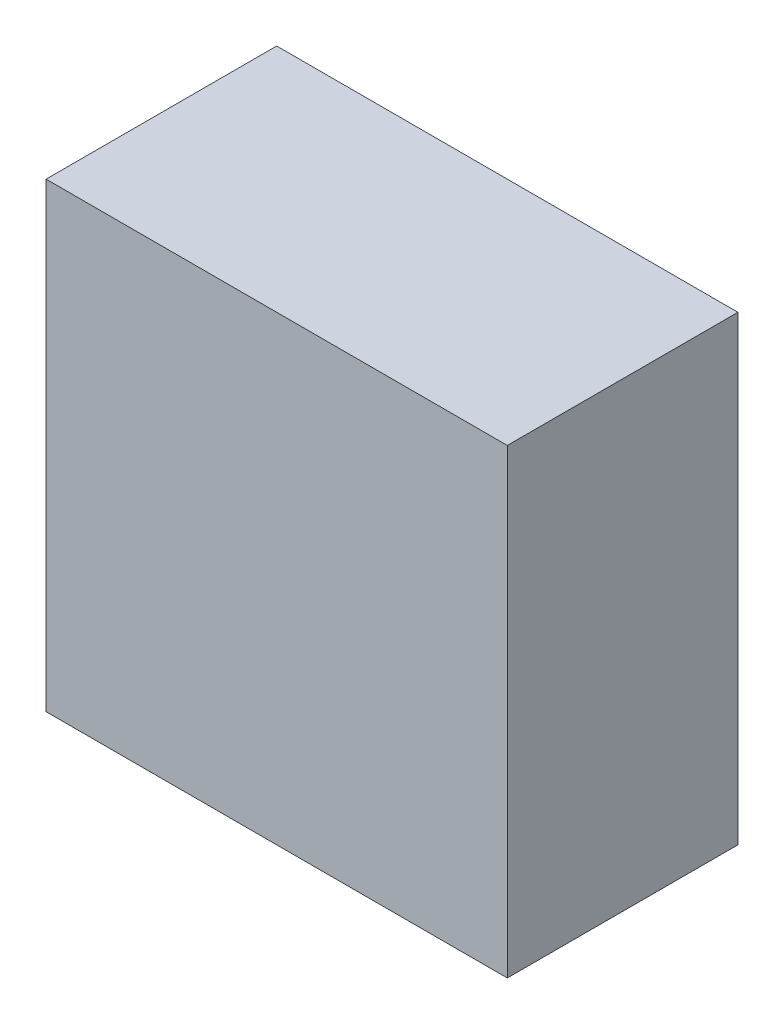
ISO-10303-21;
HEADER;
FILE_DESCRIPTION(('STEP AP214'),'2;1');
FILE_NAME('part.step','',(''),(''),'','','');
FILE_SCHEMA(('AUTOMOTIVE_DESIGN { 1 0 10303 214 1 1 1 1 }'));
ENDSEC;
DATA;
#1=APPLICATION_CONTEXT('core data for automotive mechanical design processes');
#2=APPLICATION_PROTOCOL_DEFINITION('international standard','automotive_design',2000,#1);
#3=PRODUCT_CONTEXT('',#1,'mechanical');
#4=PRODUCT('Part','Part','',(#3));
#5=PRODUCT_RELATED_PRODUCT_CATEGORY('part','',(#4));
#6=PRODUCT_DEFINITION_FORMATION('','',#4);
#7=PRODUCT_DEFINITION_CONTEXT('part definition',#1,'design');
#8=PRODUCT_DEFINITION('design','',#6,#7);
#9=PRODUCT_DEFINITION_SHAPE('','',#8);
#10=(LENGTH_UNIT() NAMED_UNIT(*) SI_UNIT(.MILLI.,.METRE.));
#11=(NAMED_UNIT(*) PLANE_ANGLE_UNIT() SI_UNIT($,.RADIAN.));
#12=(NAMED_UNIT(*) SI_UNIT($,.STERADIAN.) SOLID_ANGLE_UNIT());
#13=UNCERTAINTY_MEASURE_WITH_UNIT(LENGTH_MEASURE(1.E-05),#10,'distance_accuracy_value','');
#14=(GEOMETRIC_REPRESENTATION_CONTEXT(3) GLOBAL_UNCERTAINTY_ASSIGNED_CONTEXT((#13)) GLOBAL_UNIT_ASSIGNED_CONTEXT((#10,
#11,#12)) REPRESENTATION_CONTEXT('',''));
#15=CARTESIAN_POINT('',(0.,0.,0.));
#16=DIRECTION('',(0.,0.,1.));
#17=DIRECTION('',(1.,0.,0.));
#18=AXIS2_PLACEMENT_3D('',#15,#16,#17);
#19=CARTESIAN_POINT('',(0.,0.,1524.));
#20=DIRECTION('',(1.,0.,0.));
#21=DIRECTION('',(0.,0.,-1.));
#22=AXIS2_PLACEMENT_3D('',#19,#20,#21);
#23=PLANE('',#22);
#24=DIRECTION('',(0.,-1.,0.));
#25=VECTOR('',#24,1.);
#26=CARTESIAN_POINT('',(0.,0.,0.));
#27=LINE('',#26,#25);
#28=CARTESIAN_POINT('',(0.,3048.,0.));
#29=VERTEX_POINT('',#28);
#30=CARTESIAN_POINT('',(0.,0.,0.));
#31=VERTEX_POINT('',#30);
#32=EDGE_CURVE('E98',#29,#31,#27,.T.);
#33=ORIENTED_EDGE('',*,*,#32,.T.);
#34=DIRECTION('',(0.,0.,-1.));
#35=VECTOR('',#34,1.);
#36=CARTESIAN_POINT('',(0.,0.,1524.));
#37=LINE('',#36,#35);
#38=CARTESIAN_POINT('',(0.,0.,1524.));
#39=VERTEX_POINT('',#38);
#40=EDGE_CURVE('E11',#39,#31,#37,.T.);
#41=ORIENTED_EDGE('',*,*,#40,.F.);
#42=DIRECTION('',(0.,-1.,0.));
#43=VECTOR('',#42,1.);
#44=CARTESIAN_POINT('',(0.,0.,1524.));
#45=LINE('',#44,#43);
#46=CARTESIAN_POINT('',(0.,3048.,1524.));
#47=VERTEX_POINT('',#46);
#48=EDGE_CURVE('E86',#47,#39,#45,.T.);
#49=ORIENTED_EDGE('',*,*,#48,.F.);
#50=DIRECTION('',(0.,0.,-1.));
#51=VECTOR('',#50,1.);
#52=CARTESIAN_POINT('',(0.,3048.,1524.));
#53=LINE('',#52,#51);
#54=EDGE_CURVE('E94',#47,#29,#53,.T.);
#55=ORIENTED_EDGE('',*,*,#54,.T.);
#56=EDGE_LOOP('',(#33,#41,#49,#55));
#57=FACE_BOUND('',#56,.T.);
#58=ADVANCED_FACE('F35',(#57),#23,.F.);
#59=CARTESIAN_POINT('',(0.,0.,1524.));
#60=DIRECTION('',(0.,1.,0.));
#61=DIRECTION('',(0.,0.,1.));
#62=AXIS2_PLACEMENT_3D('',#59,#60,#61);
#63=PLANE('',#62);
#64=DIRECTION('',(1.,0.,0.));
#65=VECTOR('',#64,1.);
#66=CARTESIAN_POINT('',(0.,0.,0.));
#67=LINE('',#66,#65);
#68=CARTESIAN_POINT('',(3048.,0.,0.));
#69=VERTEX_POINT('',#68);
#70=EDGE_CURVE('E90',#31,#69,#67,.T.);
#71=ORIENTED_EDGE('',*,*,#70,.T.);
#72=DIRECTION('',(0.,0.,-1.));
#73=VECTOR('',#72,1.);
#74=CARTESIAN_POINT('',(3048.,0.,1524.));
#75=LINE('',#74,#73);
#76=CARTESIAN_POINT('',(3048.,0.,1524.));
#77=VERTEX_POINT('',#76);
#78=EDGE_CURVE('E43',#77,#69,#75,.T.);
#79=ORIENTED_EDGE('',*,*,#78,.F.);
#80=DIRECTION('',(1.,0.,0.));
#81=VECTOR('',#80,1.);
#82=CARTESIAN_POINT('',(0.,0.,1524.));
#83=LINE('',#82,#81);
#84=EDGE_CURVE('E81',#39,#77,#83,.T.);
#85=ORIENTED_EDGE('',*,*,#84,.F.);
#86=ORIENTED_EDGE('',*,*,#40,.T.);
#87=EDGE_LOOP('',(#71,#79,#85,#86));
#88=FACE_BOUND('',#87,.T.);
#89=ADVANCED_FACE('F89',(#88),#63,.F.);
#90=CARTESIAN_POINT('',(3048.,0.,1524.));
#91=DIRECTION('',(-1.,0.,0.));
#92=DIRECTION('',(0.,0.,1.));
#93=AXIS2_PLACEMENT_3D('',#90,#91,#92);
#94=PLANE('',#93);
#95=DIRECTION('',(0.,1.,0.));
#96=VECTOR('',#95,1.);
#97=CARTESIAN_POINT('',(3048.,0.,0.));
#98=LINE('',#97,#96);
#99=CARTESIAN_POINT('',(3048.,3048.,0.));
#100=VERTEX_POINT('',#99);
#101=EDGE_CURVE('E68',#69,#100,#98,.T.);
#102=ORIENTED_EDGE('',*,*,#101,.T.);
#103=DIRECTION('',(0.,0.,-1.));
#104=VECTOR('',#103,1.);
#105=CARTESIAN_POINT('',(3048.,3048.,1524.));
#106=LINE('',#105,#104);
#107=CARTESIAN_POINT('',(3048.,3048.,1524.));
#108=VERTEX_POINT('',#107);
#109=EDGE_CURVE('E91',#108,#100,#106,.T.);
#110=ORIENTED_EDGE('',*,*,#109,.F.);
#111=DIRECTION('',(0.,1.,0.));
#112=VECTOR('',#111,1.);
#113=CARTESIAN_POINT('',(3048.,0.,1524.));
#114=LINE('',#113,#112);
#115=EDGE_CURVE('E84',#77,#108,#114,.T.);
#116=ORIENTED_EDGE('',*,*,#115,.F.);
#117=ORIENTED_EDGE('',*,*,#78,.T.);
#118=EDGE_LOOP('',(#102,#110,#116,#117));
#119=FACE_BOUND('',#118,.T.);
#120=ADVANCED_FACE('F92',(#119),#94,.F.);
#121=CARTESIAN_POINT('',(0.,3048.,1524.));
#122=DIRECTION('',(0.,-1.,0.));
#123=DIRECTION('',(0.,0.,-1.));
#124=AXIS2_PLACEMENT_3D('',#121,#122,#123);
#125=PLANE('',#124);
#126=DIRECTION('',(-1.,0.,0.));
#127=VECTOR('',#126,1.);
#128=CARTESIAN_POINT('',(0.,3048.,0.));
#129=LINE('',#128,#127);
#130=EDGE_CURVE('E74',#100,#29,#129,.T.);
#131=ORIENTED_EDGE('',*,*,#130,.T.);
#132=ORIENTED_EDGE('',*,*,#54,.F.);
#133=DIRECTION('',(-1.,0.,0.));
#134=VECTOR('',#133,1.);
#135=CARTESIAN_POINT('',(0.,3048.,1524.));
#136=LINE('',#135,#134);
#137=EDGE_CURVE('E51',#108,#47,#136,.T.);
#138=ORIENTED_EDGE('',*,*,#137,.F.);
#139=ORIENTED_EDGE('',*,*,#109,.T.);
#140=EDGE_LOOP('',(#131,#132,#138,#139));
#141=FACE_BOUND('',#140,.T.);
#142=ADVANCED_FACE('F105',(#141),#125,.F.);
#143=CARTESIAN_POINT('',(0.,0.,1524.));
#144=DIRECTION('',(0.,0.,-1.));
#145=DIRECTION('',(-1.,0.,0.));
#146=AXIS2_PLACEMENT_3D('',#143,#144,#145);
#147=PLANE('',#146);
#148=ORIENTED_EDGE('',*,*,#48,.T.);
#149=ORIENTED_EDGE('',*,*,#84,.T.);
#150=ORIENTED_EDGE('',*,*,#115,.T.);
#151=ORIENTED_EDGE('',*,*,#137,.T.);
#152=EDGE_LOOP('',(#148,#149,#150,#151));
#153=FACE_BOUND('',#152,.T.);
#154=ADVANCED_FACE('F82',(#153),#147,.F.);
#155=CARTESIAN_POINT('',(0.,0.,0.));
#156=DIRECTION('',(0.,0.,-1.));
#157=DIRECTION('',(-1.,0.,0.));
#158=AXIS2_PLACEMENT_3D('',#155,#156,#157);
#159=PLANE('',#158);
#160=ORIENTED_EDGE('',*,*,#32,.F.);
#161=ORIENTED_EDGE('',*,*,#130,.F.);
#162=ORIENTED_EDGE('',*,*,#101,.F.);
#163=ORIENTED_EDGE('',*,*,#70,.F.);
#164=EDGE_LOOP('',(#160,#161,#162,#163));
#165=FACE_BOUND('',#164,.T.);
#166=ADVANCED_FACE('F108',(#165),#159,.T.);
#167=CLOSED_SHELL('',(#58,#89,#120,#142,#154,#166));
#168=MANIFOLD_SOLID_BREP('B2',#167);
#169=ADVANCED_BREP_SHAPE_REPRESENTATION('',(#18,#168),#14);
#170=SHAPE_DEFINITION_REPRESENTATION(#9,#169);
ENDSEC;
END-ISO-10303-21;
